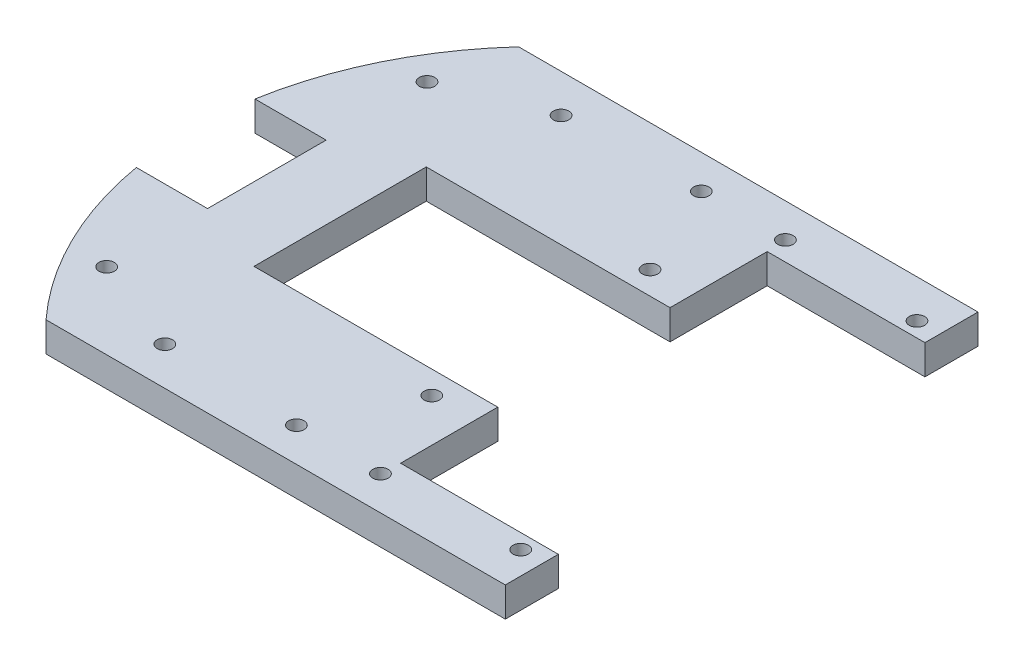
ISO-10303-21;
HEADER;
FILE_DESCRIPTION(('STEP AP214'),'2;1');
FILE_NAME('part.step','',(''),(''),'','','');
FILE_SCHEMA(('AUTOMOTIVE_DESIGN { 1 0 10303 214 1 1 1 1 }'));
ENDSEC;
DATA;
#1=APPLICATION_CONTEXT('core data for automotive mechanical design processes');
#2=APPLICATION_PROTOCOL_DEFINITION('international standard','automotive_design',2000,#1);
#3=PRODUCT_CONTEXT('',#1,'mechanical');
#4=PRODUCT('Part','Part','',(#3));
#5=PRODUCT_RELATED_PRODUCT_CATEGORY('part','',(#4));
#6=PRODUCT_DEFINITION_FORMATION('','',#4);
#7=PRODUCT_DEFINITION_CONTEXT('part definition',#1,'design');
#8=PRODUCT_DEFINITION('design','',#6,#7);
#9=PRODUCT_DEFINITION_SHAPE('','',#8);
#10=(LENGTH_UNIT() NAMED_UNIT(*) SI_UNIT(.MILLI.,.METRE.));
#11=(NAMED_UNIT(*) PLANE_ANGLE_UNIT() SI_UNIT($,.RADIAN.));
#12=(NAMED_UNIT(*) SI_UNIT($,.STERADIAN.) SOLID_ANGLE_UNIT());
#13=UNCERTAINTY_MEASURE_WITH_UNIT(LENGTH_MEASURE(1.E-05),#10,'distance_accuracy_value','');
#14=(GEOMETRIC_REPRESENTATION_CONTEXT(3) GLOBAL_UNCERTAINTY_ASSIGNED_CONTEXT((#13)) GLOBAL_UNIT_ASSIGNED_CONTEXT((#10,
#11,#12)) REPRESENTATION_CONTEXT('',''));
#15=CARTESIAN_POINT('',(0.,0.,0.));
#16=DIRECTION('',(0.,0.,1.));
#17=DIRECTION('',(1.,0.,0.));
#18=AXIS2_PLACEMENT_3D('',#15,#16,#17);
#19=CARTESIAN_POINT('',(42.9841521364057,6.35,-25.6108044423336));
#20=DIRECTION('',(0.,-1.,0.));
#21=DIRECTION('',(0.,0.,-1.));
#22=AXIS2_PLACEMENT_3D('',#19,#20,#21);
#23=PLANE('',#22);
#24=CARTESIAN_POINT('',(81.084152136406,6.35,-68.0288044423338));
#25=DIRECTION('',(0.,1.,0.));
#26=DIRECTION('',(0.,0.,-1.));
#27=AXIS2_PLACEMENT_3D('',#24,#25,#26);
#28=CIRCLE('',#27,1.65100000000001);
#29=CARTESIAN_POINT('',(81.084152136406,6.35,-69.6798044423338));
#30=VERTEX_POINT('',#29);
#31=EDGE_CURVE('E359',#30,#30,#28,.T.);
#32=ORIENTED_EDGE('',*,*,#31,.F.);
#33=EDGE_LOOP('',(#32));
#34=FACE_BOUND('',#33,.T.);
#35=CARTESIAN_POINT('',(33.983402136406,6.35,-68.9642662483282));
#36=DIRECTION('',(0.,1.,0.));
#37=DIRECTION('',(0.,0.,-1.));
#38=AXIS2_PLACEMENT_3D('',#35,#36,#37);
#39=CIRCLE('',#38,1.65100000000001);
#40=CARTESIAN_POINT('',(33.983402136406,6.35,-70.6152662483282));
#41=VERTEX_POINT('',#40);
#42=EDGE_CURVE('E347',#41,#41,#39,.T.);
#43=ORIENTED_EDGE('',*,*,#42,.F.);
#44=EDGE_LOOP('',(#43));
#45=FACE_BOUND('',#44,.T.);
#46=CARTESIAN_POINT('',(-15.6927606779155,6.35,8.67919555766623));
#47=DIRECTION('',(0.,1.,0.));
#48=DIRECTION('',(0.,0.,1.));
#49=AXIS2_PLACEMENT_3D('',#46,#47,#48);
#50=CIRCLE('',#49,1.651);
#51=CARTESIAN_POINT('',(-15.6927606779155,6.35,10.3301955576662));
#52=VERTEX_POINT('',#51);
#53=EDGE_CURVE('E335',#52,#52,#50,.T.);
#54=ORIENTED_EDGE('',*,*,#53,.F.);
#55=EDGE_LOOP('',(#54));
#56=FACE_BOUND('',#55,.T.);
#57=CARTESIAN_POINT('',(33.983402136406,6.35,17.7426573636606));
#58=DIRECTION('',(0.,1.,0.));
#59=DIRECTION('',(0.,0.,1.));
#60=AXIS2_PLACEMENT_3D('',#57,#58,#59);
#61=CIRCLE('',#60,1.65100000000001);
#62=CARTESIAN_POINT('',(33.983402136406,6.35,19.3936573636606));
#63=VERTEX_POINT('',#62);
#64=EDGE_CURVE('E323',#63,#63,#61,.T.);
#65=ORIENTED_EDGE('',*,*,#64,.F.);
#66=EDGE_LOOP('',(#65));
#67=FACE_BOUND('',#66,.T.);
#68=CARTESIAN_POINT('',(-15.6927606779155,6.35,-59.9008044423338));
#69=DIRECTION('',(0.,1.,0.));
#70=DIRECTION('',(0.,0.,1.));
#71=AXIS2_PLACEMENT_3D('',#68,#69,#70);
#72=CIRCLE('',#71,1.651);
#73=CARTESIAN_POINT('',(-15.6927606779155,6.35,-58.2498044423338));
#74=VERTEX_POINT('',#73);
#75=EDGE_CURVE('E311',#74,#74,#72,.T.);
#76=ORIENTED_EDGE('',*,*,#75,.F.);
#77=EDGE_LOOP('',(#76));
#78=FACE_BOUND('',#77,.T.);
#79=CARTESIAN_POINT('',(4.88415213640597,6.35,16.8071955576662));
#80=DIRECTION('',(0.,1.,0.));
#81=DIRECTION('',(0.,0.,1.));
#82=AXIS2_PLACEMENT_3D('',#79,#80,#81);
#83=CIRCLE('',#82,1.65100000000001);
#84=CARTESIAN_POINT('',(4.88415213640597,6.35,18.4581955576662));
#85=VERTEX_POINT('',#84);
#86=EDGE_CURVE('E183',#85,#85,#83,.T.);
#87=ORIENTED_EDGE('',*,*,#86,.F.);
#88=EDGE_LOOP('',(#87));
#89=FACE_BOUND('',#88,.T.);
#90=DIRECTION('',(0.,0.,-1.));
#91=VECTOR('',#90,1.);
#92=CARTESIAN_POINT('',(85.9683042728119,6.35,13.6321955576663));
#93=LINE('',#92,#91);
#94=CARTESIAN_POINT('',(85.968304272812,6.35,24.9926573636606));
#95=VERTEX_POINT('',#94);
#96=CARTESIAN_POINT('',(85.9683042728119,6.35,13.6321955576663));
#97=VERTEX_POINT('',#96);
#98=EDGE_CURVE('E214',#95,#97,#93,.T.);
#99=ORIENTED_EDGE('',*,*,#98,.T.);
#100=DIRECTION('',(-1.,0.,0.));
#101=VECTOR('',#100,1.);
#102=CARTESIAN_POINT('',(52.191652136406,6.35,13.6321955576663));
#103=LINE('',#102,#101);
#104=CARTESIAN_POINT('',(52.191652136406,6.35,13.6321955576663));
#105=VERTEX_POINT('',#104);
#106=EDGE_CURVE('E115',#97,#105,#103,.T.);
#107=ORIENTED_EDGE('',*,*,#106,.T.);
#108=DIRECTION('',(0.,0.,-1.));
#109=VECTOR('',#108,1.);
#110=CARTESIAN_POINT('',(52.191652136406,6.35,-7.16888164862214));
#111=LINE('',#110,#109);
#112=CARTESIAN_POINT('',(52.191652136406,6.35,-7.16888164862214));
#113=VERTEX_POINT('',#112);
#114=EDGE_CURVE('E253',#105,#113,#111,.T.);
#115=ORIENTED_EDGE('',*,*,#114,.T.);
#116=DIRECTION('',(-1.,0.,0.));
#117=VECTOR('',#116,1.);
#118=CARTESIAN_POINT('',(33.776652136406,6.35,-7.16888164862214));
#119=LINE('',#118,#117);
#120=CARTESIAN_POINT('',(0.,6.35,-7.16888164862214));
#121=VERTEX_POINT('',#120);
#122=EDGE_CURVE('E268',#113,#121,#119,.T.);
#123=ORIENTED_EDGE('',*,*,#122,.T.);
#124=DIRECTION('',(0.,0.,-1.));
#125=VECTOR('',#124,1.);
#126=CARTESIAN_POINT('',(0.,6.35,-44.0527272360455));
#127=LINE('',#126,#125);
#128=CARTESIAN_POINT('',(0.,6.35,-44.0527272360455));
#129=VERTEX_POINT('',#128);
#130=EDGE_CURVE('E265',#121,#129,#127,.T.);
#131=ORIENTED_EDGE('',*,*,#130,.T.);
#132=DIRECTION('',(1.,0.,0.));
#133=VECTOR('',#132,1.);
#134=CARTESIAN_POINT('',(33.776652136406,6.35,-44.0527272360455));
#135=LINE('',#134,#133);
#136=CARTESIAN_POINT('',(52.191652136406,6.35,-44.0527272360455));
#137=VERTEX_POINT('',#136);
#138=EDGE_CURVE('E267',#129,#137,#135,.T.);
#139=ORIENTED_EDGE('',*,*,#138,.T.);
#140=DIRECTION('',(0.,0.,-1.));
#141=VECTOR('',#140,1.);
#142=CARTESIAN_POINT('',(52.191652136406,6.35,-44.0527272360455));
#143=LINE('',#142,#141);
#144=CARTESIAN_POINT('',(52.191652136406,6.35,-64.8538044423339));
#145=VERTEX_POINT('',#144);
#146=EDGE_CURVE('E270',#137,#145,#143,.T.);
#147=ORIENTED_EDGE('',*,*,#146,.T.);
#148=DIRECTION('',(1.,0.,0.));
#149=VECTOR('',#148,1.);
#150=CARTESIAN_POINT('',(52.191652136406,6.35,-64.8538044423339));
#151=LINE('',#150,#149);
#152=CARTESIAN_POINT('',(85.9683042728119,6.35,-64.8538044423339));
#153=VERTEX_POINT('',#152);
#154=EDGE_CURVE('E276',#145,#153,#151,.T.);
#155=ORIENTED_EDGE('',*,*,#154,.T.);
#156=DIRECTION('',(0.,0.,-1.));
#157=VECTOR('',#156,1.);
#158=CARTESIAN_POINT('',(85.9683042728119,6.35,-64.8538044423339));
#159=LINE('',#158,#157);
#160=CARTESIAN_POINT('',(85.968304272812,6.35,-76.2142662483282));
#161=VERTEX_POINT('',#160);
#162=EDGE_CURVE('E278',#153,#161,#159,.T.);
#163=ORIENTED_EDGE('',*,*,#162,.T.);
#164=DIRECTION('',(-1.,0.,0.));
#165=VECTOR('',#164,1.);
#166=CARTESIAN_POINT('',(0.,6.35,-76.2142662483282));
#167=LINE('',#166,#165);
#168=CARTESIAN_POINT('',(-12.3718742134798,6.35,-76.2142662483282));
#169=VERTEX_POINT('',#168);
#170=EDGE_CURVE('E280',#161,#169,#167,.T.);
#171=ORIENTED_EDGE('',*,*,#170,.T.);
#172=CARTESIAN_POINT('',(42.9841521364057,6.35,-25.6108044423336));
#173=DIRECTION('',(0.,1.,0.));
#174=DIRECTION('',(0.,0.,1.));
#175=AXIS2_PLACEMENT_3D('',#172,#173,#174);
#176=CIRCLE('',#175,74.9999999999998);
#177=CARTESIAN_POINT('',(-30.9327606779154,6.35,-38.3108044423338));
#178=VERTEX_POINT('',#177);
#179=EDGE_CURVE('E282',#169,#178,#176,.T.);
#180=ORIENTED_EDGE('',*,*,#179,.T.);
#181=DIRECTION('',(1.,0.,0.));
#182=VECTOR('',#181,1.);
#183=CARTESIAN_POINT('',(-30.9327606779154,6.35,-38.3108044423338));
#184=LINE('',#183,#182);
#185=CARTESIAN_POINT('',(-15.6927606779155,6.35,-38.3108044423338));
#186=VERTEX_POINT('',#185);
#187=EDGE_CURVE('E284',#178,#186,#184,.T.);
#188=ORIENTED_EDGE('',*,*,#187,.T.);
#189=DIRECTION('',(0.,0.,1.));
#190=VECTOR('',#189,1.);
#191=CARTESIAN_POINT('',(-15.6927606779155,6.35,-38.3108044423338));
#192=LINE('',#191,#190);
#193=CARTESIAN_POINT('',(-15.6927606779155,6.35,-12.9108044423338));
#194=VERTEX_POINT('',#193);
#195=EDGE_CURVE('E159',#186,#194,#192,.T.);
#196=ORIENTED_EDGE('',*,*,#195,.T.);
#197=DIRECTION('',(-1.,0.,0.));
#198=VECTOR('',#197,1.);
#199=CARTESIAN_POINT('',(-15.6927606779155,6.35,-12.9108044423338));
#200=LINE('',#199,#198);
#201=CARTESIAN_POINT('',(-30.9327606779154,6.35,-12.9108044423338));
#202=VERTEX_POINT('',#201);
#203=EDGE_CURVE('E152',#194,#202,#200,.T.);
#204=ORIENTED_EDGE('',*,*,#203,.T.);
#205=CARTESIAN_POINT('',(42.9841521364057,6.35,-25.6108044423336));
#206=DIRECTION('',(0.,1.,0.));
#207=DIRECTION('',(0.,0.,-1.));
#208=AXIS2_PLACEMENT_3D('',#205,#206,#207);
#209=CIRCLE('',#208,74.9999999999997);
#210=CARTESIAN_POINT('',(-12.3718742134799,6.35,24.9926573636606));
#211=VERTEX_POINT('',#210);
#212=EDGE_CURVE('E156',#202,#211,#209,.T.);
#213=ORIENTED_EDGE('',*,*,#212,.T.);
#214=DIRECTION('',(1.,0.,0.));
#215=VECTOR('',#214,1.);
#216=CARTESIAN_POINT('',(0.,6.35,24.9926573636606));
#217=LINE('',#216,#215);
#218=EDGE_CURVE('E50',#211,#95,#217,.T.);
#219=ORIENTED_EDGE('',*,*,#218,.T.);
#220=EDGE_LOOP('',(#99,#107,#115,#123,#131,#139,#147,#155,#163,#171,#180,#188,#196,#204,#213,#219));
#221=FACE_BOUND('',#220,.T.);
#222=CARTESIAN_POINT('',(81.084152136406,6.35,16.8071955576662));
#223=DIRECTION('',(0.,1.,0.));
#224=DIRECTION('',(0.,0.,1.));
#225=AXIS2_PLACEMENT_3D('',#222,#223,#224);
#226=CIRCLE('',#225,1.65100000000001);
#227=CARTESIAN_POINT('',(81.084152136406,6.35,18.4581955576662));
#228=VERTEX_POINT('',#227);
#229=EDGE_CURVE('E305',#228,#228,#226,.T.);
#230=ORIENTED_EDGE('',*,*,#229,.F.);
#231=EDGE_LOOP('',(#230));
#232=FACE_BOUND('',#231,.T.);
#233=CARTESIAN_POINT('',(42.984152136406,6.35,-2.24280444233378));
#234=DIRECTION('',(0.,1.,0.));
#235=DIRECTION('',(0.,0.,1.));
#236=AXIS2_PLACEMENT_3D('',#233,#234,#235);
#237=CIRCLE('',#236,1.65100000000001);
#238=CARTESIAN_POINT('',(42.984152136406,6.35,-0.591804442333772));
#239=VERTEX_POINT('',#238);
#240=EDGE_CURVE('E317',#239,#239,#237,.T.);
#241=ORIENTED_EDGE('',*,*,#240,.F.);
#242=EDGE_LOOP('',(#241));
#243=FACE_BOUND('',#242,.T.);
#244=CARTESIAN_POINT('',(51.983402136406,6.35,17.7426573636606));
#245=DIRECTION('',(0.,1.,0.));
#246=DIRECTION('',(0.,0.,1.));
#247=AXIS2_PLACEMENT_3D('',#244,#245,#246);
#248=CIRCLE('',#247,1.65100000000001);
#249=CARTESIAN_POINT('',(51.983402136406,6.35,19.3936573636606));
#250=VERTEX_POINT('',#249);
#251=EDGE_CURVE('E329',#250,#250,#248,.T.);
#252=ORIENTED_EDGE('',*,*,#251,.F.);
#253=EDGE_LOOP('',(#252));
#254=FACE_BOUND('',#253,.T.);
#255=CARTESIAN_POINT('',(51.983402136406,6.35,-68.9642662483282));
#256=DIRECTION('',(0.,1.,0.));
#257=DIRECTION('',(0.,0.,-1.));
#258=AXIS2_PLACEMENT_3D('',#255,#256,#257);
#259=CIRCLE('',#258,1.65100000000001);
#260=CARTESIAN_POINT('',(51.983402136406,6.35,-70.6152662483282));
#261=VERTEX_POINT('',#260);
#262=EDGE_CURVE('E341',#261,#261,#259,.T.);
#263=ORIENTED_EDGE('',*,*,#262,.F.);
#264=EDGE_LOOP('',(#263));
#265=FACE_BOUND('',#264,.T.);
#266=CARTESIAN_POINT('',(42.984152136406,6.35,-48.9788044423338));
#267=DIRECTION('',(0.,1.,0.));
#268=DIRECTION('',(0.,0.,-1.));
#269=AXIS2_PLACEMENT_3D('',#266,#267,#268);
#270=CIRCLE('',#269,1.65100000000001);
#271=CARTESIAN_POINT('',(42.984152136406,6.35,-50.6298044423338));
#272=VERTEX_POINT('',#271);
#273=EDGE_CURVE('E353',#272,#272,#270,.T.);
#274=ORIENTED_EDGE('',*,*,#273,.F.);
#275=EDGE_LOOP('',(#274));
#276=FACE_BOUND('',#275,.T.);
#277=CARTESIAN_POINT('',(4.88415213640596,6.35,-68.0288044423338));
#278=DIRECTION('',(0.,1.,0.));
#279=DIRECTION('',(0.,0.,-1.));
#280=AXIS2_PLACEMENT_3D('',#277,#278,#279);
#281=CIRCLE('',#280,1.651);
#282=CARTESIAN_POINT('',(4.88415213640596,6.35,-69.6798044423338));
#283=VERTEX_POINT('',#282);
#284=EDGE_CURVE('E365',#283,#283,#281,.T.);
#285=ORIENTED_EDGE('',*,*,#284,.F.);
#286=EDGE_LOOP('',(#285));
#287=FACE_BOUND('',#286,.T.);
#288=ADVANCED_FACE('F33',(#34,#45,#56,#67,#78,#89,#221,#232,#243,#254,#265,#276,#287),#23,.F.);
#289=CARTESIAN_POINT('',(42.9841521364057,0.,-25.6108044423336));
#290=DIRECTION('',(0.,-1.,0.));
#291=DIRECTION('',(0.,0.,-1.));
#292=AXIS2_PLACEMENT_3D('',#289,#290,#291);
#293=PLANE('',#292);
#294=CARTESIAN_POINT('',(81.084152136406,0.,-68.0288044423338));
#295=DIRECTION('',(0.,1.,0.));
#296=DIRECTION('',(0.,0.,-1.));
#297=AXIS2_PLACEMENT_3D('',#294,#295,#296);
#298=CIRCLE('',#297,1.65100000000001);
#299=CARTESIAN_POINT('',(81.084152136406,0.,-69.6798044423338));
#300=VERTEX_POINT('',#299);
#301=EDGE_CURVE('E362',#300,#300,#298,.T.);
#302=ORIENTED_EDGE('',*,*,#301,.T.);
#303=EDGE_LOOP('',(#302));
#304=FACE_BOUND('',#303,.T.);
#305=CARTESIAN_POINT('',(33.983402136406,0.,-68.9642662483282));
#306=DIRECTION('',(0.,1.,0.));
#307=DIRECTION('',(0.,0.,-1.));
#308=AXIS2_PLACEMENT_3D('',#305,#306,#307);
#309=CIRCLE('',#308,1.65100000000001);
#310=CARTESIAN_POINT('',(33.983402136406,0.,-70.6152662483282));
#311=VERTEX_POINT('',#310);
#312=EDGE_CURVE('E350',#311,#311,#309,.T.);
#313=ORIENTED_EDGE('',*,*,#312,.T.);
#314=EDGE_LOOP('',(#313));
#315=FACE_BOUND('',#314,.T.);
#316=CARTESIAN_POINT('',(-15.6927606779155,0.,8.67919555766623));
#317=DIRECTION('',(0.,1.,0.));
#318=DIRECTION('',(0.,0.,1.));
#319=AXIS2_PLACEMENT_3D('',#316,#317,#318);
#320=CIRCLE('',#319,1.651);
#321=CARTESIAN_POINT('',(-15.6927606779155,0.,10.3301955576662));
#322=VERTEX_POINT('',#321);
#323=EDGE_CURVE('E338',#322,#322,#320,.T.);
#324=ORIENTED_EDGE('',*,*,#323,.T.);
#325=EDGE_LOOP('',(#324));
#326=FACE_BOUND('',#325,.T.);
#327=CARTESIAN_POINT('',(33.983402136406,0.,17.7426573636606));
#328=DIRECTION('',(0.,1.,0.));
#329=DIRECTION('',(0.,0.,1.));
#330=AXIS2_PLACEMENT_3D('',#327,#328,#329);
#331=CIRCLE('',#330,1.65100000000001);
#332=CARTESIAN_POINT('',(33.983402136406,0.,19.3936573636606));
#333=VERTEX_POINT('',#332);
#334=EDGE_CURVE('E326',#333,#333,#331,.T.);
#335=ORIENTED_EDGE('',*,*,#334,.T.);
#336=EDGE_LOOP('',(#335));
#337=FACE_BOUND('',#336,.T.);
#338=CARTESIAN_POINT('',(-15.6927606779155,0.,-59.9008044423338));
#339=DIRECTION('',(0.,1.,0.));
#340=DIRECTION('',(0.,0.,1.));
#341=AXIS2_PLACEMENT_3D('',#338,#339,#340);
#342=CIRCLE('',#341,1.651);
#343=CARTESIAN_POINT('',(-15.6927606779155,0.,-58.2498044423338));
#344=VERTEX_POINT('',#343);
#345=EDGE_CURVE('E314',#344,#344,#342,.T.);
#346=ORIENTED_EDGE('',*,*,#345,.T.);
#347=EDGE_LOOP('',(#346));
#348=FACE_BOUND('',#347,.T.);
#349=CARTESIAN_POINT('',(4.88415213640597,0.,16.8071955576662));
#350=DIRECTION('',(0.,1.,0.));
#351=DIRECTION('',(0.,0.,1.));
#352=AXIS2_PLACEMENT_3D('',#349,#350,#351);
#353=CIRCLE('',#352,1.65100000000001);
#354=CARTESIAN_POINT('',(4.88415213640597,0.,18.4581955576662));
#355=VERTEX_POINT('',#354);
#356=EDGE_CURVE('E302',#355,#355,#353,.T.);
#357=ORIENTED_EDGE('',*,*,#356,.T.);
#358=EDGE_LOOP('',(#357));
#359=FACE_BOUND('',#358,.T.);
#360=DIRECTION('',(0.,0.,-1.));
#361=VECTOR('',#360,1.);
#362=CARTESIAN_POINT('',(85.9683042728119,0.,13.6321955576663));
#363=LINE('',#362,#361);
#364=CARTESIAN_POINT('',(85.968304272812,0.,24.9926573636606));
#365=VERTEX_POINT('',#364);
#366=CARTESIAN_POINT('',(85.9683042728119,0.,13.6321955576663));
#367=VERTEX_POINT('',#366);
#368=EDGE_CURVE('E179',#365,#367,#363,.T.);
#369=ORIENTED_EDGE('',*,*,#368,.F.);
#370=DIRECTION('',(1.,0.,0.));
#371=VECTOR('',#370,1.);
#372=CARTESIAN_POINT('',(0.,0.,24.9926573636606));
#373=LINE('',#372,#371);
#374=CARTESIAN_POINT('',(-12.3718742134799,0.,24.9926573636606));
#375=VERTEX_POINT('',#374);
#376=EDGE_CURVE('E103',#375,#365,#373,.T.);
#377=ORIENTED_EDGE('',*,*,#376,.F.);
#378=CARTESIAN_POINT('',(42.9841521364057,0.,-25.6108044423336));
#379=DIRECTION('',(0.,1.,0.));
#380=DIRECTION('',(0.,0.,-1.));
#381=AXIS2_PLACEMENT_3D('',#378,#379,#380);
#382=CIRCLE('',#381,74.9999999999997);
#383=CARTESIAN_POINT('',(-30.9327606779154,0.,-12.9108044423338));
#384=VERTEX_POINT('',#383);
#385=EDGE_CURVE('E211',#384,#375,#382,.T.);
#386=ORIENTED_EDGE('',*,*,#385,.F.);
#387=DIRECTION('',(-1.,0.,0.));
#388=VECTOR('',#387,1.);
#389=CARTESIAN_POINT('',(-15.6927606779155,0.,-12.9108044423338));
#390=LINE('',#389,#388);
#391=CARTESIAN_POINT('',(-15.6927606779155,0.,-12.9108044423338));
#392=VERTEX_POINT('',#391);
#393=EDGE_CURVE('E168',#392,#384,#390,.T.);
#394=ORIENTED_EDGE('',*,*,#393,.F.);
#395=DIRECTION('',(0.,0.,1.));
#396=VECTOR('',#395,1.);
#397=CARTESIAN_POINT('',(-15.6927606779155,0.,-38.3108044423338));
#398=LINE('',#397,#396);
#399=CARTESIAN_POINT('',(-15.6927606779155,0.,-38.3108044423338));
#400=VERTEX_POINT('',#399);
#401=EDGE_CURVE('E208',#400,#392,#398,.T.);
#402=ORIENTED_EDGE('',*,*,#401,.F.);
#403=DIRECTION('',(1.,0.,0.));
#404=VECTOR('',#403,1.);
#405=CARTESIAN_POINT('',(-30.9327606779154,0.,-38.3108044423338));
#406=LINE('',#405,#404);
#407=CARTESIAN_POINT('',(-30.9327606779154,0.,-38.3108044423338));
#408=VERTEX_POINT('',#407);
#409=EDGE_CURVE('E206',#408,#400,#406,.T.);
#410=ORIENTED_EDGE('',*,*,#409,.F.);
#411=CARTESIAN_POINT('',(42.9841521364057,0.,-25.6108044423336));
#412=DIRECTION('',(0.,1.,0.));
#413=DIRECTION('',(0.,0.,1.));
#414=AXIS2_PLACEMENT_3D('',#411,#412,#413);
#415=CIRCLE('',#414,74.9999999999998);
#416=CARTESIAN_POINT('',(-12.3718742134798,0.,-76.2142662483282));
#417=VERTEX_POINT('',#416);
#418=EDGE_CURVE('E204',#417,#408,#415,.T.);
#419=ORIENTED_EDGE('',*,*,#418,.F.);
#420=DIRECTION('',(-1.,0.,0.));
#421=VECTOR('',#420,1.);
#422=CARTESIAN_POINT('',(0.,0.,-76.2142662483282));
#423=LINE('',#422,#421);
#424=CARTESIAN_POINT('',(85.968304272812,0.,-76.2142662483282));
#425=VERTEX_POINT('',#424);
#426=EDGE_CURVE('E202',#425,#417,#423,.T.);
#427=ORIENTED_EDGE('',*,*,#426,.F.);
#428=DIRECTION('',(0.,0.,-1.));
#429=VECTOR('',#428,1.);
#430=CARTESIAN_POINT('',(85.9683042728119,0.,-64.8538044423339));
#431=LINE('',#430,#429);
#432=CARTESIAN_POINT('',(85.9683042728119,0.,-64.8538044423339));
#433=VERTEX_POINT('',#432);
#434=EDGE_CURVE('E199',#433,#425,#431,.T.);
#435=ORIENTED_EDGE('',*,*,#434,.F.);
#436=DIRECTION('',(1.,0.,0.));
#437=VECTOR('',#436,1.);
#438=CARTESIAN_POINT('',(52.191652136406,0.,-64.8538044423339));
#439=LINE('',#438,#437);
#440=CARTESIAN_POINT('',(52.191652136406,0.,-64.8538044423339));
#441=VERTEX_POINT('',#440);
#442=EDGE_CURVE('E197',#441,#433,#439,.T.);
#443=ORIENTED_EDGE('',*,*,#442,.F.);
#444=DIRECTION('',(0.,0.,-1.));
#445=VECTOR('',#444,1.);
#446=CARTESIAN_POINT('',(52.191652136406,0.,-44.0527272360455));
#447=LINE('',#446,#445);
#448=CARTESIAN_POINT('',(52.191652136406,0.,-44.0527272360455));
#449=VERTEX_POINT('',#448);
#450=EDGE_CURVE('E195',#449,#441,#447,.T.);
#451=ORIENTED_EDGE('',*,*,#450,.F.);
#452=DIRECTION('',(1.,0.,0.));
#453=VECTOR('',#452,1.);
#454=CARTESIAN_POINT('',(33.776652136406,0.,-44.0527272360455));
#455=LINE('',#454,#453);
#456=CARTESIAN_POINT('',(0.,0.,-44.0527272360455));
#457=VERTEX_POINT('',#456);
#458=EDGE_CURVE('E193',#457,#449,#455,.T.);
#459=ORIENTED_EDGE('',*,*,#458,.F.);
#460=DIRECTION('',(0.,0.,-1.));
#461=VECTOR('',#460,1.);
#462=CARTESIAN_POINT('',(0.,0.,-44.0527272360455));
#463=LINE('',#462,#461);
#464=CARTESIAN_POINT('',(0.,0.,-7.16888164862214));
#465=VERTEX_POINT('',#464);
#466=EDGE_CURVE('E190',#465,#457,#463,.T.);
#467=ORIENTED_EDGE('',*,*,#466,.F.);
#468=DIRECTION('',(-1.,0.,0.));
#469=VECTOR('',#468,1.);
#470=CARTESIAN_POINT('',(33.776652136406,0.,-7.16888164862214));
#471=LINE('',#470,#469);
#472=CARTESIAN_POINT('',(52.191652136406,0.,-7.16888164862214));
#473=VERTEX_POINT('',#472);
#474=EDGE_CURVE('E188',#473,#465,#471,.T.);
#475=ORIENTED_EDGE('',*,*,#474,.F.);
#476=DIRECTION('',(0.,0.,-1.));
#477=VECTOR('',#476,1.);
#478=CARTESIAN_POINT('',(52.191652136406,0.,-7.16888164862214));
#479=LINE('',#478,#477);
#480=CARTESIAN_POINT('',(52.191652136406,0.,13.6321955576663));
#481=VERTEX_POINT('',#480);
#482=EDGE_CURVE('E185',#481,#473,#479,.T.);
#483=ORIENTED_EDGE('',*,*,#482,.F.);
#484=DIRECTION('',(-1.,0.,0.));
#485=VECTOR('',#484,1.);
#486=CARTESIAN_POINT('',(52.191652136406,0.,13.6321955576663));
#487=LINE('',#486,#485);
#488=EDGE_CURVE('E182',#367,#481,#487,.T.);
#489=ORIENTED_EDGE('',*,*,#488,.F.);
#490=EDGE_LOOP('',(#369,#377,#386,#394,#402,#410,#419,#427,#435,#443,#451,#459,#467,#475,#483,#489));
#491=FACE_BOUND('',#490,.T.);
#492=CARTESIAN_POINT('',(81.084152136406,0.,16.8071955576662));
#493=DIRECTION('',(0.,1.,0.));
#494=DIRECTION('',(0.,0.,1.));
#495=AXIS2_PLACEMENT_3D('',#492,#493,#494);
#496=CIRCLE('',#495,1.65100000000001);
#497=CARTESIAN_POINT('',(81.084152136406,0.,18.4581955576662));
#498=VERTEX_POINT('',#497);
#499=EDGE_CURVE('E308',#498,#498,#496,.T.);
#500=ORIENTED_EDGE('',*,*,#499,.T.);
#501=EDGE_LOOP('',(#500));
#502=FACE_BOUND('',#501,.T.);
#503=CARTESIAN_POINT('',(42.984152136406,0.,-2.24280444233378));
#504=DIRECTION('',(0.,1.,0.));
#505=DIRECTION('',(0.,0.,1.));
#506=AXIS2_PLACEMENT_3D('',#503,#504,#505);
#507=CIRCLE('',#506,1.65100000000001);
#508=CARTESIAN_POINT('',(42.984152136406,0.,-0.591804442333772));
#509=VERTEX_POINT('',#508);
#510=EDGE_CURVE('E320',#509,#509,#507,.T.);
#511=ORIENTED_EDGE('',*,*,#510,.T.);
#512=EDGE_LOOP('',(#511));
#513=FACE_BOUND('',#512,.T.);
#514=CARTESIAN_POINT('',(51.983402136406,0.,17.7426573636606));
#515=DIRECTION('',(0.,1.,0.));
#516=DIRECTION('',(0.,0.,1.));
#517=AXIS2_PLACEMENT_3D('',#514,#515,#516);
#518=CIRCLE('',#517,1.65100000000001);
#519=CARTESIAN_POINT('',(51.983402136406,0.,19.3936573636606));
#520=VERTEX_POINT('',#519);
#521=EDGE_CURVE('E332',#520,#520,#518,.T.);
#522=ORIENTED_EDGE('',*,*,#521,.T.);
#523=EDGE_LOOP('',(#522));
#524=FACE_BOUND('',#523,.T.);
#525=CARTESIAN_POINT('',(51.983402136406,0.,-68.9642662483282));
#526=DIRECTION('',(0.,1.,0.));
#527=DIRECTION('',(0.,0.,-1.));
#528=AXIS2_PLACEMENT_3D('',#525,#526,#527);
#529=CIRCLE('',#528,1.65100000000001);
#530=CARTESIAN_POINT('',(51.983402136406,0.,-70.6152662483282));
#531=VERTEX_POINT('',#530);
#532=EDGE_CURVE('E344',#531,#531,#529,.T.);
#533=ORIENTED_EDGE('',*,*,#532,.T.);
#534=EDGE_LOOP('',(#533));
#535=FACE_BOUND('',#534,.T.);
#536=CARTESIAN_POINT('',(42.984152136406,0.,-48.9788044423338));
#537=DIRECTION('',(0.,1.,0.));
#538=DIRECTION('',(0.,0.,-1.));
#539=AXIS2_PLACEMENT_3D('',#536,#537,#538);
#540=CIRCLE('',#539,1.65100000000001);
#541=CARTESIAN_POINT('',(42.984152136406,0.,-50.6298044423338));
#542=VERTEX_POINT('',#541);
#543=EDGE_CURVE('E356',#542,#542,#540,.T.);
#544=ORIENTED_EDGE('',*,*,#543,.T.);
#545=EDGE_LOOP('',(#544));
#546=FACE_BOUND('',#545,.T.);
#547=CARTESIAN_POINT('',(4.88415213640596,0.,-68.0288044423338));
#548=DIRECTION('',(0.,1.,0.));
#549=DIRECTION('',(0.,0.,-1.));
#550=AXIS2_PLACEMENT_3D('',#547,#548,#549);
#551=CIRCLE('',#550,1.651);
#552=CARTESIAN_POINT('',(4.88415213640596,0.,-69.6798044423338));
#553=VERTEX_POINT('',#552);
#554=EDGE_CURVE('E368',#553,#553,#551,.T.);
#555=ORIENTED_EDGE('',*,*,#554,.T.);
#556=EDGE_LOOP('',(#555));
#557=FACE_BOUND('',#556,.T.);
#558=ADVANCED_FACE('F254',(#304,#315,#326,#337,#348,#359,#491,#502,#513,#524,#535,#546,#557),
#293,.T.);
#559=CARTESIAN_POINT('',(85.9683042728119,6.35,13.6321955576663));
#560=DIRECTION('',(-1.,0.,0.));
#561=DIRECTION('',(0.,0.,1.));
#562=AXIS2_PLACEMENT_3D('',#559,#560,#561);
#563=PLANE('',#562);
#564=ORIENTED_EDGE('',*,*,#368,.T.);
#565=DIRECTION('',(0.,-1.,0.));
#566=VECTOR('',#565,1.);
#567=CARTESIAN_POINT('',(85.9683042728119,6.35,13.6321955576663));
#568=LINE('',#567,#566);
#569=EDGE_CURVE('E11',#97,#367,#568,.T.);
#570=ORIENTED_EDGE('',*,*,#569,.F.);
#571=ORIENTED_EDGE('',*,*,#98,.F.);
#572=DIRECTION('',(0.,-1.,0.));
#573=VECTOR('',#572,1.);
#574=CARTESIAN_POINT('',(85.968304272812,6.35,24.9926573636606));
#575=LINE('',#574,#573);
#576=EDGE_CURVE('E175',#95,#365,#575,.T.);
#577=ORIENTED_EDGE('',*,*,#576,.T.);
#578=EDGE_LOOP('',(#564,#570,#571,#577));
#579=FACE_BOUND('',#578,.T.);
#580=ADVANCED_FACE('F35',(#579),#563,.F.);
#581=CARTESIAN_POINT('',(52.191652136406,6.35,13.6321955576663));
#582=DIRECTION('',(0.,0.,1.));
#583=DIRECTION('',(1.,0.,0.));
#584=AXIS2_PLACEMENT_3D('',#581,#582,#583);
#585=PLANE('',#584);
#586=ORIENTED_EDGE('',*,*,#488,.T.);
#587=DIRECTION('',(0.,-1.,0.));
#588=VECTOR('',#587,1.);
#589=CARTESIAN_POINT('',(52.191652136406,6.35,13.6321955576663));
#590=LINE('',#589,#588);
#591=EDGE_CURVE('E42',#105,#481,#590,.T.);
#592=ORIENTED_EDGE('',*,*,#591,.F.);
#593=ORIENTED_EDGE('',*,*,#106,.F.);
#594=ORIENTED_EDGE('',*,*,#569,.T.);
#595=EDGE_LOOP('',(#586,#592,#593,#594));
#596=FACE_BOUND('',#595,.T.);
#597=ADVANCED_FACE('F430',(#596),#585,.F.);
#598=CARTESIAN_POINT('',(52.191652136406,6.35,-7.16888164862214));
#599=DIRECTION('',(-1.,0.,0.));
#600=DIRECTION('',(0.,0.,1.));
#601=AXIS2_PLACEMENT_3D('',#598,#599,#600);
#602=PLANE('',#601);
#603=ORIENTED_EDGE('',*,*,#482,.T.);
#604=DIRECTION('',(0.,-1.,0.));
#605=VECTOR('',#604,1.);
#606=CARTESIAN_POINT('',(52.191652136406,6.35,-7.16888164862214));
#607=LINE('',#606,#605);
#608=EDGE_CURVE('E245',#113,#473,#607,.T.);
#609=ORIENTED_EDGE('',*,*,#608,.F.);
#610=ORIENTED_EDGE('',*,*,#114,.F.);
#611=ORIENTED_EDGE('',*,*,#591,.T.);
#612=EDGE_LOOP('',(#603,#609,#610,#611));
#613=FACE_BOUND('',#612,.T.);
#614=ADVANCED_FACE('F251',(#613),#602,.F.);
#615=CARTESIAN_POINT('',(33.776652136406,6.35,-7.16888164862214));
#616=DIRECTION('',(0.,0.,1.));
#617=DIRECTION('',(1.,0.,0.));
#618=AXIS2_PLACEMENT_3D('',#615,#616,#617);
#619=PLANE('',#618);
#620=ORIENTED_EDGE('',*,*,#474,.T.);
#621=DIRECTION('',(0.,-1.,0.));
#622=VECTOR('',#621,1.);
#623=CARTESIAN_POINT('',(0.,6.35,-7.16888164862214));
#624=LINE('',#623,#622);
#625=EDGE_CURVE('E242',#121,#465,#624,.T.);
#626=ORIENTED_EDGE('',*,*,#625,.F.);
#627=ORIENTED_EDGE('',*,*,#122,.F.);
#628=ORIENTED_EDGE('',*,*,#608,.T.);
#629=EDGE_LOOP('',(#620,#626,#627,#628));
#630=FACE_BOUND('',#629,.T.);
#631=ADVANCED_FACE('F259',(#630),#619,.F.);
#632=CARTESIAN_POINT('',(0.,6.35,-44.0527272360455));
#633=DIRECTION('',(-1.,0.,0.));
#634=DIRECTION('',(0.,0.,1.));
#635=AXIS2_PLACEMENT_3D('',#632,#633,#634);
#636=PLANE('',#635);
#637=ORIENTED_EDGE('',*,*,#466,.T.);
#638=DIRECTION('',(0.,-1.,0.));
#639=VECTOR('',#638,1.);
#640=CARTESIAN_POINT('',(0.,6.35,-44.0527272360455));
#641=LINE('',#640,#639);
#642=EDGE_CURVE('E239',#129,#457,#641,.T.);
#643=ORIENTED_EDGE('',*,*,#642,.F.);
#644=ORIENTED_EDGE('',*,*,#130,.F.);
#645=ORIENTED_EDGE('',*,*,#625,.T.);
#646=EDGE_LOOP('',(#637,#643,#644,#645));
#647=FACE_BOUND('',#646,.T.);
#648=ADVANCED_FACE('F263',(#647),#636,.F.);
#649=CARTESIAN_POINT('',(33.776652136406,6.35,-44.0527272360455));
#650=DIRECTION('',(0.,0.,-1.));
#651=DIRECTION('',(-1.,0.,0.));
#652=AXIS2_PLACEMENT_3D('',#649,#650,#651);
#653=PLANE('',#652);
#654=ORIENTED_EDGE('',*,*,#458,.T.);
#655=DIRECTION('',(0.,-1.,0.));
#656=VECTOR('',#655,1.);
#657=CARTESIAN_POINT('',(52.191652136406,6.35,-44.0527272360455));
#658=LINE('',#657,#656);
#659=EDGE_CURVE('E236',#137,#449,#658,.T.);
#660=ORIENTED_EDGE('',*,*,#659,.F.);
#661=ORIENTED_EDGE('',*,*,#138,.F.);
#662=ORIENTED_EDGE('',*,*,#642,.T.);
#663=EDGE_LOOP('',(#654,#660,#661,#662));
#664=FACE_BOUND('',#663,.T.);
#665=ADVANCED_FACE('F420',(#664),#653,.F.);
#666=CARTESIAN_POINT('',(52.191652136406,6.35,-44.0527272360455));
#667=DIRECTION('',(-1.,0.,0.));
#668=DIRECTION('',(0.,0.,1.));
#669=AXIS2_PLACEMENT_3D('',#666,#667,#668);
#670=PLANE('',#669);
#671=ORIENTED_EDGE('',*,*,#450,.T.);
#672=DIRECTION('',(0.,-1.,0.));
#673=VECTOR('',#672,1.);
#674=CARTESIAN_POINT('',(52.191652136406,6.35,-64.8538044423339));
#675=LINE('',#674,#673);
#676=EDGE_CURVE('E233',#145,#441,#675,.T.);
#677=ORIENTED_EDGE('',*,*,#676,.F.);
#678=ORIENTED_EDGE('',*,*,#146,.F.);
#679=ORIENTED_EDGE('',*,*,#659,.T.);
#680=EDGE_LOOP('',(#671,#677,#678,#679));
#681=FACE_BOUND('',#680,.T.);
#682=ADVANCED_FACE('F416',(#681),#670,.F.);
#683=CARTESIAN_POINT('',(52.191652136406,6.35,-64.8538044423339));
#684=DIRECTION('',(0.,0.,-1.));
#685=DIRECTION('',(-1.,0.,0.));
#686=AXIS2_PLACEMENT_3D('',#683,#684,#685);
#687=PLANE('',#686);
#688=ORIENTED_EDGE('',*,*,#442,.T.);
#689=DIRECTION('',(0.,-1.,0.));
#690=VECTOR('',#689,1.);
#691=CARTESIAN_POINT('',(85.9683042728119,6.35,-64.8538044423339));
#692=LINE('',#691,#690);
#693=EDGE_CURVE('E230',#153,#433,#692,.T.);
#694=ORIENTED_EDGE('',*,*,#693,.F.);
#695=ORIENTED_EDGE('',*,*,#154,.F.);
#696=ORIENTED_EDGE('',*,*,#676,.T.);
#697=EDGE_LOOP('',(#688,#694,#695,#696));
#698=FACE_BOUND('',#697,.T.);
#699=ADVANCED_FACE('F412',(#698),#687,.F.);
#700=CARTESIAN_POINT('',(85.9683042728119,6.35,-64.8538044423339));
#701=DIRECTION('',(-1.,0.,0.));
#702=DIRECTION('',(0.,0.,1.));
#703=AXIS2_PLACEMENT_3D('',#700,#701,#702);
#704=PLANE('',#703);
#705=ORIENTED_EDGE('',*,*,#434,.T.);
#706=DIRECTION('',(0.,-1.,0.));
#707=VECTOR('',#706,1.);
#708=CARTESIAN_POINT('',(85.968304272812,6.35,-76.2142662483282));
#709=LINE('',#708,#707);
#710=EDGE_CURVE('E227',#161,#425,#709,.T.);
#711=ORIENTED_EDGE('',*,*,#710,.F.);
#712=ORIENTED_EDGE('',*,*,#162,.F.);
#713=ORIENTED_EDGE('',*,*,#693,.T.);
#714=EDGE_LOOP('',(#705,#711,#712,#713));
#715=FACE_BOUND('',#714,.T.);
#716=ADVANCED_FACE('F408',(#715),#704,.F.);
#717=CARTESIAN_POINT('',(0.,6.35,-76.2142662483282));
#718=DIRECTION('',(0.,0.,1.));
#719=DIRECTION('',(1.,0.,0.));
#720=AXIS2_PLACEMENT_3D('',#717,#718,#719);
#721=PLANE('',#720);
#722=ORIENTED_EDGE('',*,*,#426,.T.);
#723=DIRECTION('',(0.,-1.,0.));
#724=VECTOR('',#723,1.);
#725=CARTESIAN_POINT('',(-12.3718742134798,6.35,-76.2142662483282));
#726=LINE('',#725,#724);
#727=EDGE_CURVE('E224',#169,#417,#726,.T.);
#728=ORIENTED_EDGE('',*,*,#727,.F.);
#729=ORIENTED_EDGE('',*,*,#170,.F.);
#730=ORIENTED_EDGE('',*,*,#710,.T.);
#731=EDGE_LOOP('',(#722,#728,#729,#730));
#732=FACE_BOUND('',#731,.T.);
#733=ADVANCED_FACE('F404',(#732),#721,.F.);
#734=CARTESIAN_POINT('',(42.9841521364057,6.35,-25.6108044423336));
#735=DIRECTION('',(0.,-1.,0.));
#736=DIRECTION('',(0.,0.,-1.));
#737=AXIS2_PLACEMENT_3D('',#734,#735,#736);
#738=CYLINDRICAL_SURFACE('',#737,74.9999999999998);
#739=ORIENTED_EDGE('',*,*,#418,.T.);
#740=DIRECTION('',(0.,-1.,0.));
#741=VECTOR('',#740,1.);
#742=CARTESIAN_POINT('',(-30.9327606779154,6.35,-38.3108044423338));
#743=LINE('',#742,#741);
#744=EDGE_CURVE('E221',#178,#408,#743,.T.);
#745=ORIENTED_EDGE('',*,*,#744,.F.);
#746=ORIENTED_EDGE('',*,*,#179,.F.);
#747=ORIENTED_EDGE('',*,*,#727,.T.);
#748=EDGE_LOOP('',(#739,#745,#746,#747));
#749=FACE_BOUND('',#748,.T.);
#750=ADVANCED_FACE('F401',(#749),#738,.T.);
#751=CARTESIAN_POINT('',(-30.9327606779154,6.35,-38.3108044423338));
#752=DIRECTION('',(0.,0.,-1.));
#753=DIRECTION('',(-1.,0.,0.));
#754=AXIS2_PLACEMENT_3D('',#751,#752,#753);
#755=PLANE('',#754);
#756=ORIENTED_EDGE('',*,*,#409,.T.);
#757=DIRECTION('',(0.,-1.,0.));
#758=VECTOR('',#757,1.);
#759=CARTESIAN_POINT('',(-15.6927606779155,6.35,-38.3108044423338));
#760=LINE('',#759,#758);
#761=EDGE_CURVE('E218',#186,#400,#760,.T.);
#762=ORIENTED_EDGE('',*,*,#761,.F.);
#763=ORIENTED_EDGE('',*,*,#187,.F.);
#764=ORIENTED_EDGE('',*,*,#744,.T.);
#765=EDGE_LOOP('',(#756,#762,#763,#764));
#766=FACE_BOUND('',#765,.T.);
#767=ADVANCED_FACE('F290',(#766),#755,.F.);
#768=CARTESIAN_POINT('',(-15.6927606779155,6.35,-38.3108044423338));
#769=DIRECTION('',(1.,0.,0.));
#770=DIRECTION('',(0.,0.,-1.));
#771=AXIS2_PLACEMENT_3D('',#768,#769,#770);
#772=PLANE('',#771);
#773=ORIENTED_EDGE('',*,*,#401,.T.);
#774=DIRECTION('',(0.,-1.,0.));
#775=VECTOR('',#774,1.);
#776=CARTESIAN_POINT('',(-15.6927606779155,6.35,-12.9108044423338));
#777=LINE('',#776,#775);
#778=EDGE_CURVE('E170',#194,#392,#777,.T.);
#779=ORIENTED_EDGE('',*,*,#778,.F.);
#780=ORIENTED_EDGE('',*,*,#195,.F.);
#781=ORIENTED_EDGE('',*,*,#761,.T.);
#782=EDGE_LOOP('',(#773,#779,#780,#781));
#783=FACE_BOUND('',#782,.T.);
#784=ADVANCED_FACE('F294',(#783),#772,.F.);
#785=CARTESIAN_POINT('',(-15.6927606779155,6.35,-12.9108044423338));
#786=DIRECTION('',(0.,0.,1.));
#787=DIRECTION('',(1.,0.,0.));
#788=AXIS2_PLACEMENT_3D('',#785,#786,#787);
#789=PLANE('',#788);
#790=ORIENTED_EDGE('',*,*,#393,.T.);
#791=DIRECTION('',(0.,-1.,0.));
#792=VECTOR('',#791,1.);
#793=CARTESIAN_POINT('',(-30.9327606779154,6.35,-12.9108044423338));
#794=LINE('',#793,#792);
#795=EDGE_CURVE('E165',#202,#384,#794,.T.);
#796=ORIENTED_EDGE('',*,*,#795,.F.);
#797=ORIENTED_EDGE('',*,*,#203,.F.);
#798=ORIENTED_EDGE('',*,*,#778,.T.);
#799=EDGE_LOOP('',(#790,#796,#797,#798));
#800=FACE_BOUND('',#799,.T.);
#801=ADVANCED_FACE('F166',(#800),#789,.F.);
#802=CARTESIAN_POINT('',(42.9841521364057,6.35,-25.6108044423336));
#803=DIRECTION('',(0.,-1.,0.));
#804=DIRECTION('',(0.,0.,-1.));
#805=AXIS2_PLACEMENT_3D('',#802,#803,#804);
#806=CYLINDRICAL_SURFACE('',#805,74.9999999999997);
#807=ORIENTED_EDGE('',*,*,#385,.T.);
#808=DIRECTION('',(0.,-1.,0.));
#809=VECTOR('',#808,1.);
#810=CARTESIAN_POINT('',(-12.3718742134799,6.35,24.9926573636606));
#811=LINE('',#810,#809);
#812=EDGE_CURVE('E171',#211,#375,#811,.T.);
#813=ORIENTED_EDGE('',*,*,#812,.F.);
#814=ORIENTED_EDGE('',*,*,#212,.F.);
#815=ORIENTED_EDGE('',*,*,#795,.T.);
#816=EDGE_LOOP('',(#807,#813,#814,#815));
#817=FACE_BOUND('',#816,.T.);
#818=ADVANCED_FACE('F173',(#817),#806,.T.);
#819=CARTESIAN_POINT('',(0.,6.35,24.9926573636606));
#820=DIRECTION('',(0.,0.,-1.));
#821=DIRECTION('',(-1.,0.,0.));
#822=AXIS2_PLACEMENT_3D('',#819,#820,#821);
#823=PLANE('',#822);
#824=ORIENTED_EDGE('',*,*,#376,.T.);
#825=ORIENTED_EDGE('',*,*,#576,.F.);
#826=ORIENTED_EDGE('',*,*,#218,.F.);
#827=ORIENTED_EDGE('',*,*,#812,.T.);
#828=EDGE_LOOP('',(#824,#825,#826,#827));
#829=FACE_BOUND('',#828,.T.);
#830=ADVANCED_FACE('F295',(#829),#823,.F.);
#831=CARTESIAN_POINT('',(4.88415213640597,6.35,16.8071955576662));
#832=DIRECTION('',(0.,-1.,0.));
#833=DIRECTION('',(0.,0.,-1.));
#834=AXIS2_PLACEMENT_3D('',#831,#832,#833);
#835=CYLINDRICAL_SURFACE('',#834,1.65100000000001);
#836=ORIENTED_EDGE('',*,*,#86,.T.);
#837=EDGE_LOOP('',(#836));
#838=FACE_BOUND('',#837,.T.);
#839=ORIENTED_EDGE('',*,*,#356,.F.);
#840=EDGE_LOOP('',(#839));
#841=FACE_BOUND('',#840,.T.);
#842=ADVANCED_FACE('F388',(#838,#841),#835,.F.);
#843=CARTESIAN_POINT('',(81.084152136406,6.35,16.8071955576662));
#844=DIRECTION('',(0.,-1.,0.));
#845=DIRECTION('',(0.,0.,-1.));
#846=AXIS2_PLACEMENT_3D('',#843,#844,#845);
#847=CYLINDRICAL_SURFACE('',#846,1.65100000000001);
#848=ORIENTED_EDGE('',*,*,#229,.T.);
#849=EDGE_LOOP('',(#848));
#850=FACE_BOUND('',#849,.T.);
#851=ORIENTED_EDGE('',*,*,#499,.F.);
#852=EDGE_LOOP('',(#851));
#853=FACE_BOUND('',#852,.T.);
#854=ADVANCED_FACE('F543',(#850,#853),#847,.F.);
#855=CARTESIAN_POINT('',(-15.6927606779155,6.35,-59.9008044423338));
#856=DIRECTION('',(0.,-1.,0.));
#857=DIRECTION('',(0.,0.,-1.));
#858=AXIS2_PLACEMENT_3D('',#855,#856,#857);
#859=CYLINDRICAL_SURFACE('',#858,1.651);
#860=ORIENTED_EDGE('',*,*,#75,.T.);
#861=EDGE_LOOP('',(#860));
#862=FACE_BOUND('',#861,.T.);
#863=ORIENTED_EDGE('',*,*,#345,.F.);
#864=EDGE_LOOP('',(#863));
#865=FACE_BOUND('',#864,.T.);
#866=ADVANCED_FACE('F551',(#862,#865),#859,.F.);
#867=CARTESIAN_POINT('',(42.984152136406,6.35,-2.24280444233378));
#868=DIRECTION('',(0.,-1.,0.));
#869=DIRECTION('',(0.,0.,-1.));
#870=AXIS2_PLACEMENT_3D('',#867,#868,#869);
#871=CYLINDRICAL_SURFACE('',#870,1.65100000000001);
#872=ORIENTED_EDGE('',*,*,#240,.T.);
#873=EDGE_LOOP('',(#872));
#874=FACE_BOUND('',#873,.T.);
#875=ORIENTED_EDGE('',*,*,#510,.F.);
#876=EDGE_LOOP('',(#875));
#877=FACE_BOUND('',#876,.T.);
#878=ADVANCED_FACE('F559',(#874,#877),#871,.F.);
#879=CARTESIAN_POINT('',(33.983402136406,6.35,17.7426573636606));
#880=DIRECTION('',(0.,-1.,0.));
#881=DIRECTION('',(0.,0.,-1.));
#882=AXIS2_PLACEMENT_3D('',#879,#880,#881);
#883=CYLINDRICAL_SURFACE('',#882,1.65100000000001);
#884=ORIENTED_EDGE('',*,*,#64,.T.);
#885=EDGE_LOOP('',(#884));
#886=FACE_BOUND('',#885,.T.);
#887=ORIENTED_EDGE('',*,*,#334,.F.);
#888=EDGE_LOOP('',(#887));
#889=FACE_BOUND('',#888,.T.);
#890=ADVANCED_FACE('F568',(#886,#889),#883,.F.);
#891=CARTESIAN_POINT('',(51.983402136406,6.35,17.7426573636606));
#892=DIRECTION('',(0.,-1.,0.));
#893=DIRECTION('',(0.,0.,-1.));
#894=AXIS2_PLACEMENT_3D('',#891,#892,#893);
#895=CYLINDRICAL_SURFACE('',#894,1.65100000000001);
#896=ORIENTED_EDGE('',*,*,#251,.T.);
#897=EDGE_LOOP('',(#896));
#898=FACE_BOUND('',#897,.T.);
#899=ORIENTED_EDGE('',*,*,#521,.F.);
#900=EDGE_LOOP('',(#899));
#901=FACE_BOUND('',#900,.T.);
#902=ADVANCED_FACE('F577',(#898,#901),#895,.F.);
#903=CARTESIAN_POINT('',(-15.6927606779155,6.35,8.67919555766623));
#904=DIRECTION('',(0.,-1.,0.));
#905=DIRECTION('',(0.,0.,-1.));
#906=AXIS2_PLACEMENT_3D('',#903,#904,#905);
#907=CYLINDRICAL_SURFACE('',#906,1.651);
#908=ORIENTED_EDGE('',*,*,#53,.T.);
#909=EDGE_LOOP('',(#908));
#910=FACE_BOUND('',#909,.T.);
#911=ORIENTED_EDGE('',*,*,#323,.F.);
#912=EDGE_LOOP('',(#911));
#913=FACE_BOUND('',#912,.T.);
#914=ADVANCED_FACE('F586',(#910,#913),#907,.F.);
#915=CARTESIAN_POINT('',(51.983402136406,6.35,-68.9642662483282));
#916=DIRECTION('',(0.,-1.,0.));
#917=DIRECTION('',(0.,0.,-1.));
#918=AXIS2_PLACEMENT_3D('',#915,#916,#917);
#919=CYLINDRICAL_SURFACE('',#918,1.65100000000001);
#920=ORIENTED_EDGE('',*,*,#262,.T.);
#921=EDGE_LOOP('',(#920));
#922=FACE_BOUND('',#921,.T.);
#923=ORIENTED_EDGE('',*,*,#532,.F.);
#924=EDGE_LOOP('',(#923));
#925=FACE_BOUND('',#924,.T.);
#926=ADVANCED_FACE('F595',(#922,#925),#919,.F.);
#927=CARTESIAN_POINT('',(33.983402136406,6.35,-68.9642662483282));
#928=DIRECTION('',(0.,-1.,0.));
#929=DIRECTION('',(0.,0.,-1.));
#930=AXIS2_PLACEMENT_3D('',#927,#928,#929);
#931=CYLINDRICAL_SURFACE('',#930,1.65100000000001);
#932=ORIENTED_EDGE('',*,*,#42,.T.);
#933=EDGE_LOOP('',(#932));
#934=FACE_BOUND('',#933,.T.);
#935=ORIENTED_EDGE('',*,*,#312,.F.);
#936=EDGE_LOOP('',(#935));
#937=FACE_BOUND('',#936,.T.);
#938=ADVANCED_FACE('F604',(#934,#937),#931,.F.);
#939=CARTESIAN_POINT('',(42.984152136406,6.35,-48.9788044423338));
#940=DIRECTION('',(0.,-1.,0.));
#941=DIRECTION('',(0.,0.,-1.));
#942=AXIS2_PLACEMENT_3D('',#939,#940,#941);
#943=CYLINDRICAL_SURFACE('',#942,1.65100000000001);
#944=ORIENTED_EDGE('',*,*,#273,.T.);
#945=EDGE_LOOP('',(#944));
#946=FACE_BOUND('',#945,.T.);
#947=ORIENTED_EDGE('',*,*,#543,.F.);
#948=EDGE_LOOP('',(#947));
#949=FACE_BOUND('',#948,.T.);
#950=ADVANCED_FACE('F613',(#946,#949),#943,.F.);
#951=CARTESIAN_POINT('',(81.084152136406,6.35,-68.0288044423338));
#952=DIRECTION('',(0.,-1.,0.));
#953=DIRECTION('',(0.,0.,-1.));
#954=AXIS2_PLACEMENT_3D('',#951,#952,#953);
#955=CYLINDRICAL_SURFACE('',#954,1.65100000000001);
#956=ORIENTED_EDGE('',*,*,#31,.T.);
#957=EDGE_LOOP('',(#956));
#958=FACE_BOUND('',#957,.T.);
#959=ORIENTED_EDGE('',*,*,#301,.F.);
#960=EDGE_LOOP('',(#959));
#961=FACE_BOUND('',#960,.T.);
#962=ADVANCED_FACE('F622',(#958,#961),#955,.F.);
#963=CARTESIAN_POINT('',(4.88415213640596,6.35,-68.0288044423338));
#964=DIRECTION('',(0.,-1.,0.));
#965=DIRECTION('',(0.,0.,-1.));
#966=AXIS2_PLACEMENT_3D('',#963,#964,#965);
#967=CYLINDRICAL_SURFACE('',#966,1.651);
#968=ORIENTED_EDGE('',*,*,#284,.T.);
#969=EDGE_LOOP('',(#968));
#970=FACE_BOUND('',#969,.T.);
#971=ORIENTED_EDGE('',*,*,#554,.F.);
#972=EDGE_LOOP('',(#971));
#973=FACE_BOUND('',#972,.T.);
#974=ADVANCED_FACE('F374',(#970,#973),#967,.F.);
#975=CLOSED_SHELL('',(#288,#558,#580,#597,#614,#631,#648,#665,#682,#699,#716,#733,#750,#767,
#784,#801,#818,#830,#842,#854,#866,#878,#890,#902,#914,#926,#938,#950,#962,#974));
#976=MANIFOLD_SOLID_BREP('B2',#975);
#977=ADVANCED_BREP_SHAPE_REPRESENTATION('',(#18,#976),#14);
#978=SHAPE_DEFINITION_REPRESENTATION(#9,#977);
ENDSEC;
END-ISO-10303-21;
